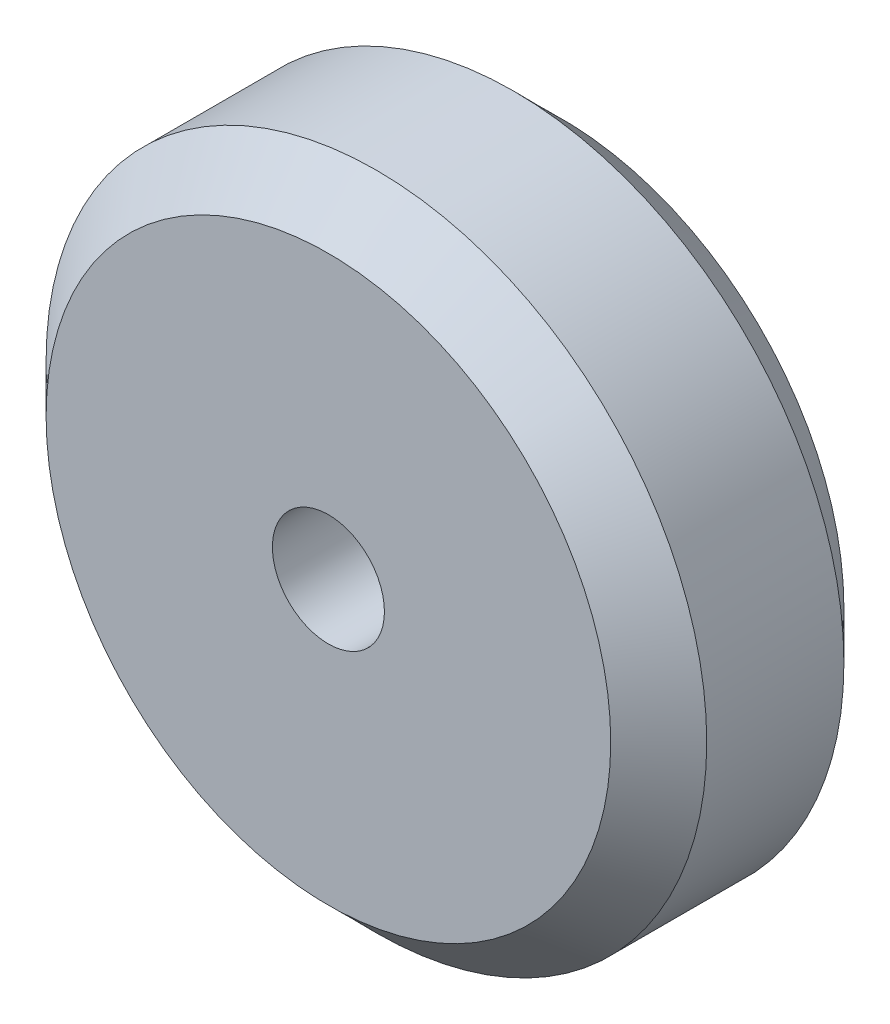
ISO-10303-21;
HEADER;
FILE_DESCRIPTION(('STEP AP214'),'2;1');
FILE_NAME('part.step','',(''),(''),'','','');
FILE_SCHEMA(('AUTOMOTIVE_DESIGN { 1 0 10303 214 1 1 1 1 }'));
ENDSEC;
DATA;
#1=APPLICATION_CONTEXT('core data for automotive mechanical design processes');
#2=APPLICATION_PROTOCOL_DEFINITION('international standard','automotive_design',2000,#1);
#3=PRODUCT_CONTEXT('',#1,'mechanical');
#4=PRODUCT('Part','Part','',(#3));
#5=PRODUCT_RELATED_PRODUCT_CATEGORY('part','',(#4));
#6=PRODUCT_DEFINITION_FORMATION('','',#4);
#7=PRODUCT_DEFINITION_CONTEXT('part definition',#1,'design');
#8=PRODUCT_DEFINITION('design','',#6,#7);
#9=PRODUCT_DEFINITION_SHAPE('','',#8);
#10=(LENGTH_UNIT() NAMED_UNIT(*) SI_UNIT(.MILLI.,.METRE.));
#11=(NAMED_UNIT(*) PLANE_ANGLE_UNIT() SI_UNIT($,.RADIAN.));
#12=(NAMED_UNIT(*) SI_UNIT($,.STERADIAN.) SOLID_ANGLE_UNIT());
#13=UNCERTAINTY_MEASURE_WITH_UNIT(LENGTH_MEASURE(1.E-05),#10,'distance_accuracy_value','');
#14=(GEOMETRIC_REPRESENTATION_CONTEXT(3) GLOBAL_UNCERTAINTY_ASSIGNED_CONTEXT((#13)) GLOBAL_UNIT_ASSIGNED_CONTEXT((#10,
#11,#12)) REPRESENTATION_CONTEXT('',''));
#15=CARTESIAN_POINT('',(0.,0.,0.));
#16=DIRECTION('',(0.,0.,1.));
#17=DIRECTION('',(1.,0.,0.));
#18=AXIS2_PLACEMENT_3D('',#15,#16,#17);
#19=CARTESIAN_POINT('',(0.,0.,3.));
#20=DIRECTION('',(0.,0.,-1.));
#21=DIRECTION('',(-1.,0.,0.));
#22=AXIS2_PLACEMENT_3D('',#19,#20,#21);
#23=CONICAL_SURFACE('',#22,14.45,0.785398163397446);
#24=CARTESIAN_POINT('',(0.,0.,5.1));
#25=DIRECTION('',(0.,0.,1.));
#26=DIRECTION('',(1.,0.,0.));
#27=AXIS2_PLACEMENT_3D('',#24,#25,#26);
#28=CIRCLE('',#27,12.35);
#29=CARTESIAN_POINT('',(12.35,0.,5.1));
#30=VERTEX_POINT('',#29);
#31=EDGE_CURVE('E66',#30,#30,#28,.T.);
#32=ORIENTED_EDGE('',*,*,#31,.F.);
#33=EDGE_LOOP('',(#32));
#34=FACE_BOUND('',#33,.T.);
#35=CARTESIAN_POINT('',(0.,0.,3.));
#36=DIRECTION('',(0.,0.,1.));
#37=DIRECTION('',(1.,0.,0.));
#38=AXIS2_PLACEMENT_3D('',#35,#36,#37);
#39=CIRCLE('',#38,14.45);
#40=CARTESIAN_POINT('',(14.45,0.,3.));
#41=VERTEX_POINT('',#40);
#42=EDGE_CURVE('E10',#41,#41,#39,.T.);
#43=ORIENTED_EDGE('',*,*,#42,.T.);
#44=EDGE_LOOP('',(#43));
#45=FACE_BOUND('',#44,.T.);
#46=ADVANCED_FACE('F39',(#34,#45),#23,.T.);
#47=CARTESIAN_POINT('',(0.,0.,5.1));
#48=DIRECTION('',(0.,0.,1.));
#49=DIRECTION('',(1.,0.,0.));
#50=AXIS2_PLACEMENT_3D('',#47,#48,#49);
#51=CYLINDRICAL_SURFACE('',#50,14.45);
#52=ORIENTED_EDGE('',*,*,#42,.F.);
#53=EDGE_LOOP('',(#52));
#54=FACE_BOUND('',#53,.T.);
#55=CARTESIAN_POINT('',(0.,0.,-3.));
#56=DIRECTION('',(0.,0.,1.));
#57=DIRECTION('',(1.,0.,0.));
#58=AXIS2_PLACEMENT_3D('',#55,#56,#57);
#59=CIRCLE('',#58,14.45);
#60=CARTESIAN_POINT('',(14.45,0.,-3.));
#61=VERTEX_POINT('',#60);
#62=EDGE_CURVE('E46',#61,#61,#59,.T.);
#63=ORIENTED_EDGE('',*,*,#62,.T.);
#64=EDGE_LOOP('',(#63));
#65=FACE_BOUND('',#64,.T.);
#66=ADVANCED_FACE('F74',(#54,#65),#51,.T.);
#67=CARTESIAN_POINT('',(0.,0.,-5.1));
#68=DIRECTION('',(0.,0.,1.));
#69=DIRECTION('',(1.,0.,0.));
#70=AXIS2_PLACEMENT_3D('',#67,#68,#69);
#71=CONICAL_SURFACE('',#70,12.35,0.78539816339745);
#72=ORIENTED_EDGE('',*,*,#62,.F.);
#73=EDGE_LOOP('',(#72));
#74=FACE_BOUND('',#73,.T.);
#75=CARTESIAN_POINT('',(0.,0.,-5.1));
#76=DIRECTION('',(0.,0.,1.));
#77=DIRECTION('',(1.,0.,0.));
#78=AXIS2_PLACEMENT_3D('',#75,#76,#77);
#79=CIRCLE('',#78,12.35);
#80=CARTESIAN_POINT('',(12.35,0.,-5.1));
#81=VERTEX_POINT('',#80);
#82=EDGE_CURVE('E51',#81,#81,#79,.T.);
#83=ORIENTED_EDGE('',*,*,#82,.T.);
#84=EDGE_LOOP('',(#83));
#85=FACE_BOUND('',#84,.T.);
#86=ADVANCED_FACE('F78',(#74,#85),#71,.T.);
#87=CARTESIAN_POINT('',(0.,12.35,-5.1));
#88=DIRECTION('',(0.,0.,1.));
#89=DIRECTION('',(1.,0.,0.));
#90=AXIS2_PLACEMENT_3D('',#87,#88,#89);
#91=PLANE('',#90);
#92=ORIENTED_EDGE('',*,*,#82,.F.);
#93=EDGE_LOOP('',(#92));
#94=FACE_BOUND('',#93,.T.);
#95=CARTESIAN_POINT('',(0.,0.,-5.1));
#96=DIRECTION('',(0.,0.,1.));
#97=DIRECTION('',(1.,0.,0.));
#98=AXIS2_PLACEMENT_3D('',#95,#96,#97);
#99=CIRCLE('',#98,2.45);
#100=CARTESIAN_POINT('',(2.45,0.,-5.1));
#101=VERTEX_POINT('',#100);
#102=EDGE_CURVE('E56',#101,#101,#99,.T.);
#103=ORIENTED_EDGE('',*,*,#102,.T.);
#104=EDGE_LOOP('',(#103));
#105=FACE_BOUND('',#104,.T.);
#106=ADVANCED_FACE('F83',(#94,#105),#91,.F.);
#107=CARTESIAN_POINT('',(0.,0.,5.1));
#108=DIRECTION('',(0.,0.,1.));
#109=DIRECTION('',(1.,0.,0.));
#110=AXIS2_PLACEMENT_3D('',#107,#108,#109);
#111=CYLINDRICAL_SURFACE('',#110,2.45);
#112=ORIENTED_EDGE('',*,*,#102,.F.);
#113=EDGE_LOOP('',(#112));
#114=FACE_BOUND('',#113,.T.);
#115=CARTESIAN_POINT('',(0.,0.,5.1));
#116=DIRECTION('',(0.,0.,1.));
#117=DIRECTION('',(1.,0.,0.));
#118=AXIS2_PLACEMENT_3D('',#115,#116,#117);
#119=CIRCLE('',#118,2.45);
#120=CARTESIAN_POINT('',(2.45,0.,5.1));
#121=VERTEX_POINT('',#120);
#122=EDGE_CURVE('E62',#121,#121,#119,.T.);
#123=ORIENTED_EDGE('',*,*,#122,.T.);
#124=EDGE_LOOP('',(#123));
#125=FACE_BOUND('',#124,.T.);
#126=ADVANCED_FACE('F89',(#114,#125),#111,.F.);
#127=CARTESIAN_POINT('',(0.,2.45,5.1));
#128=DIRECTION('',(0.,0.,-1.));
#129=DIRECTION('',(-1.,0.,0.));
#130=AXIS2_PLACEMENT_3D('',#127,#128,#129);
#131=PLANE('',#130);
#132=ORIENTED_EDGE('',*,*,#122,.F.);
#133=EDGE_LOOP('',(#132));
#134=FACE_BOUND('',#133,.T.);
#135=ORIENTED_EDGE('',*,*,#31,.T.);
#136=EDGE_LOOP('',(#135));
#137=FACE_BOUND('',#136,.T.);
#138=ADVANCED_FACE('F71',(#134,#137),#131,.F.);
#139=CLOSED_SHELL('',(#46,#66,#86,#106,#126,#138));
#140=MANIFOLD_SOLID_BREP('B2',#139);
#141=ADVANCED_BREP_SHAPE_REPRESENTATION('',(#18,#140),#14);
#142=SHAPE_DEFINITION_REPRESENTATION(#9,#141);
ENDSEC;
END-ISO-10303-21;
